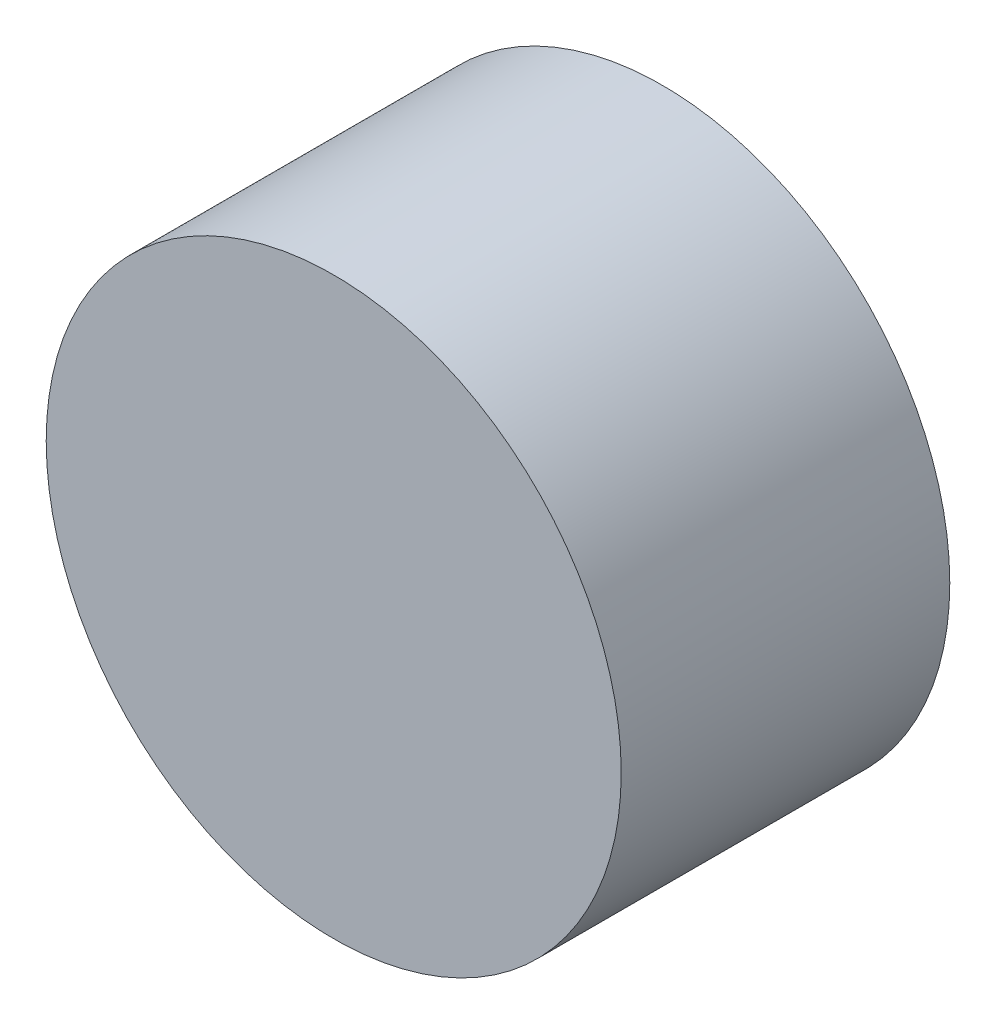
ISO-10303-21;
HEADER;
FILE_DESCRIPTION(('STEP AP214'),'2;1');
FILE_NAME('part.step','',(''),(''),'','','');
FILE_SCHEMA(('AUTOMOTIVE_DESIGN { 1 0 10303 214 1 1 1 1 }'));
ENDSEC;
DATA;
#1=APPLICATION_CONTEXT('core data for automotive mechanical design processes');
#2=APPLICATION_PROTOCOL_DEFINITION('international standard','automotive_design',2000,#1);
#3=PRODUCT_CONTEXT('',#1,'mechanical');
#4=PRODUCT('Part','Part','',(#3));
#5=PRODUCT_RELATED_PRODUCT_CATEGORY('part','',(#4));
#6=PRODUCT_DEFINITION_FORMATION('','',#4);
#7=PRODUCT_DEFINITION_CONTEXT('part definition',#1,'design');
#8=PRODUCT_DEFINITION('design','',#6,#7);
#9=PRODUCT_DEFINITION_SHAPE('','',#8);
#10=(LENGTH_UNIT() NAMED_UNIT(*) SI_UNIT(.MILLI.,.METRE.));
#11=(NAMED_UNIT(*) PLANE_ANGLE_UNIT() SI_UNIT($,.RADIAN.));
#12=(NAMED_UNIT(*) SI_UNIT($,.STERADIAN.) SOLID_ANGLE_UNIT());
#13=UNCERTAINTY_MEASURE_WITH_UNIT(LENGTH_MEASURE(1.E-05),#10,'distance_accuracy_value','');
#14=(GEOMETRIC_REPRESENTATION_CONTEXT(3) GLOBAL_UNCERTAINTY_ASSIGNED_CONTEXT((#13)) GLOBAL_UNIT_ASSIGNED_CONTEXT((#10,
#11,#12)) REPRESENTATION_CONTEXT('',''));
#15=CARTESIAN_POINT('',(0.,0.,0.));
#16=DIRECTION('',(0.,0.,1.));
#17=DIRECTION('',(1.,0.,0.));
#18=AXIS2_PLACEMENT_3D('',#15,#16,#17);
#19=CARTESIAN_POINT('',(0.,0.,20.));
#20=DIRECTION('',(0.,0.,-1.));
#21=DIRECTION('',(-1.,0.,0.));
#22=AXIS2_PLACEMENT_3D('',#19,#20,#21);
#23=CYLINDRICAL_SURFACE('',#22,17.5);
#24=CARTESIAN_POINT('',(0.,0.,20.));
#25=DIRECTION('',(0.,0.,1.));
#26=DIRECTION('',(1.,0.,0.));
#27=AXIS2_PLACEMENT_3D('',#24,#25,#26);
#28=CIRCLE('',#27,17.5);
#29=CARTESIAN_POINT('',(17.5,0.,20.));
#30=VERTEX_POINT('',#29);
#31=EDGE_CURVE('E10',#30,#30,#28,.T.);
#32=ORIENTED_EDGE('',*,*,#31,.F.);
#33=EDGE_LOOP('',(#32));
#34=FACE_BOUND('',#33,.T.);
#35=CARTESIAN_POINT('',(0.,0.,0.));
#36=DIRECTION('',(0.,0.,1.));
#37=DIRECTION('',(1.,0.,0.));
#38=AXIS2_PLACEMENT_3D('',#35,#36,#37);
#39=CIRCLE('',#38,17.5);
#40=CARTESIAN_POINT('',(17.5,0.,0.));
#41=VERTEX_POINT('',#40);
#42=EDGE_CURVE('E35',#41,#41,#39,.T.);
#43=ORIENTED_EDGE('',*,*,#42,.T.);
#44=EDGE_LOOP('',(#43));
#45=FACE_BOUND('',#44,.T.);
#46=ADVANCED_FACE('F32',(#34,#45),#23,.T.);
#47=CARTESIAN_POINT('',(0.,0.,20.));
#48=DIRECTION('',(0.,0.,1.));
#49=DIRECTION('',(1.,0.,0.));
#50=AXIS2_PLACEMENT_3D('',#47,#48,#49);
#51=PLANE('',#50);
#52=ORIENTED_EDGE('',*,*,#31,.T.);
#53=EDGE_LOOP('',(#52));
#54=FACE_BOUND('',#53,.T.);
#55=ADVANCED_FACE('F47',(#54),#51,.T.);
#56=CARTESIAN_POINT('',(0.,0.,0.));
#57=DIRECTION('',(0.,0.,1.));
#58=DIRECTION('',(1.,0.,0.));
#59=AXIS2_PLACEMENT_3D('',#56,#57,#58);
#60=PLANE('',#59);
#61=ORIENTED_EDGE('',*,*,#42,.F.);
#62=EDGE_LOOP('',(#61));
#63=FACE_BOUND('',#62,.T.);
#64=ADVANCED_FACE('F45',(#63),#60,.F.);
#65=CLOSED_SHELL('',(#46,#55,#64));
#66=MANIFOLD_SOLID_BREP('B2',#65);
#67=ADVANCED_BREP_SHAPE_REPRESENTATION('',(#18,#66),#14);
#68=SHAPE_DEFINITION_REPRESENTATION(#9,#67);
ENDSEC;
END-ISO-10303-21;
